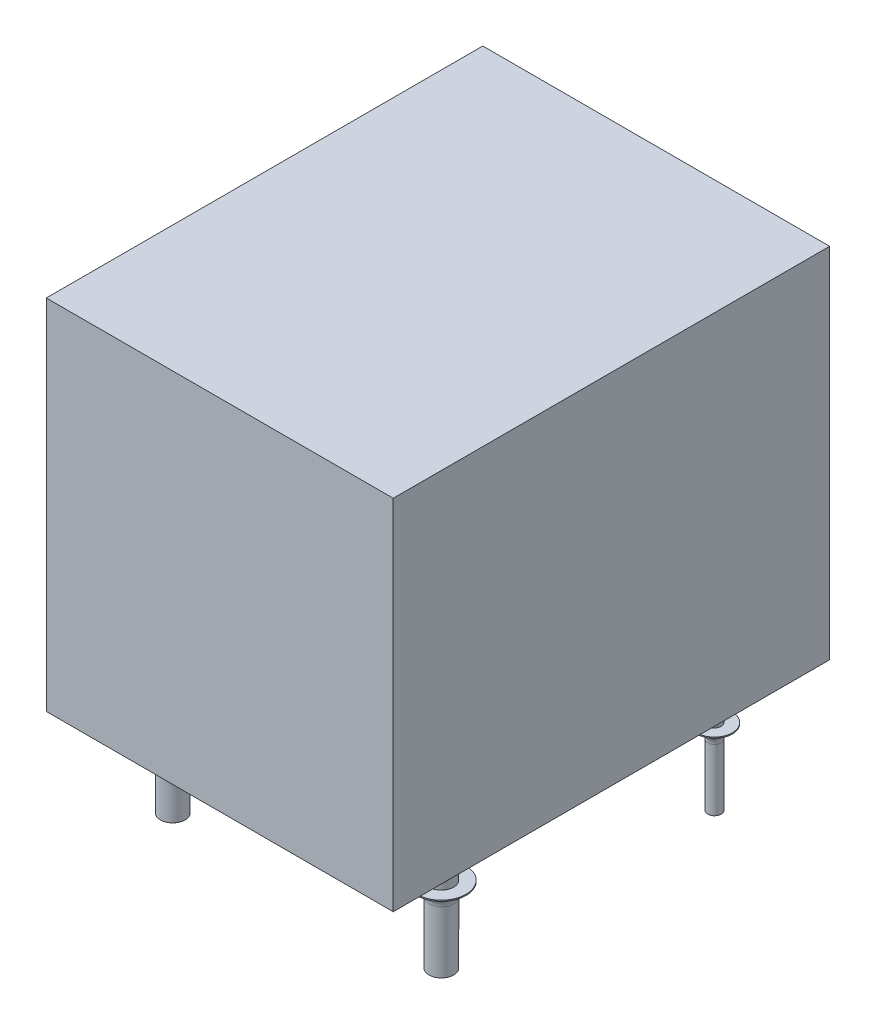
ISO-10303-21;
HEADER;
FILE_DESCRIPTION(('STEP AP214'),'2;1');
FILE_NAME('part.step','',(''),(''),'','','');
FILE_SCHEMA(('AUTOMOTIVE_DESIGN { 1 0 10303 214 1 1 1 1 }'));
ENDSEC;
DATA;
#1=APPLICATION_CONTEXT('core data for automotive mechanical design processes');
#2=APPLICATION_PROTOCOL_DEFINITION('international standard','automotive_design',2000,#1);
#3=PRODUCT_CONTEXT('',#1,'mechanical');
#4=PRODUCT('Part','Part','',(#3));
#5=PRODUCT_RELATED_PRODUCT_CATEGORY('part','',(#4));
#6=PRODUCT_DEFINITION_FORMATION('','',#4);
#7=PRODUCT_DEFINITION_CONTEXT('part definition',#1,'design');
#8=PRODUCT_DEFINITION('design','',#6,#7);
#9=PRODUCT_DEFINITION_SHAPE('','',#8);
#10=(LENGTH_UNIT() NAMED_UNIT(*) SI_UNIT(.MILLI.,.METRE.));
#11=(NAMED_UNIT(*) PLANE_ANGLE_UNIT() SI_UNIT($,.RADIAN.));
#12=(NAMED_UNIT(*) SI_UNIT($,.STERADIAN.) SOLID_ANGLE_UNIT());
#13=UNCERTAINTY_MEASURE_WITH_UNIT(LENGTH_MEASURE(1.E-05),#10,'distance_accuracy_value','');
#14=(GEOMETRIC_REPRESENTATION_CONTEXT(3) GLOBAL_UNCERTAINTY_ASSIGNED_CONTEXT((#13)) GLOBAL_UNIT_ASSIGNED_CONTEXT((#10,
#11,#12)) REPRESENTATION_CONTEXT('',''));
#15=CARTESIAN_POINT('',(0.,0.,0.));
#16=DIRECTION('',(0.,0.,1.));
#17=DIRECTION('',(1.,0.,0.));
#18=AXIS2_PLACEMENT_3D('',#15,#16,#17);
#19=CARTESIAN_POINT('',(13.75,-5.,-16.1));
#20=DIRECTION('',(0.,1.,0.));
#21=DIRECTION('',(0.,0.,1.));
#22=AXIS2_PLACEMENT_3D('',#19,#20,#21);
#23=CYLINDRICAL_SURFACE('',#22,0.300000000000001);
#24=CARTESIAN_POINT('',(13.75,0.,-16.1));
#25=DIRECTION('',(0.,-1.,0.));
#26=DIRECTION('',(0.,0.,-1.));
#27=AXIS2_PLACEMENT_3D('',#24,#25,#26);
#28=CIRCLE('',#27,0.300000000000001);
#29=CARTESIAN_POINT('',(13.75,0.,-16.4));
#30=VERTEX_POINT('',#29);
#31=EDGE_CURVE('E192',#30,#30,#28,.T.);
#32=ORIENTED_EDGE('',*,*,#31,.T.);
#33=EDGE_LOOP('',(#32));
#34=FACE_BOUND('',#33,.T.);
#35=CARTESIAN_POINT('',(13.75,-1.6,-16.1));
#36=DIRECTION('',(0.,-1.,0.));
#37=DIRECTION('',(0.,0.,-1.));
#38=AXIS2_PLACEMENT_3D('',#35,#36,#37);
#39=CIRCLE('',#38,0.300000000000001);
#40=CARTESIAN_POINT('',(13.75,-1.6,-16.4));
#41=VERTEX_POINT('',#40);
#42=EDGE_CURVE('E128',#41,#41,#39,.T.);
#43=ORIENTED_EDGE('',*,*,#42,.F.);
#44=EDGE_LOOP('',(#43));
#45=FACE_BOUND('',#44,.T.);
#46=ADVANCED_FACE('F38',(#34,#45),#23,.T.);
#47=CARTESIAN_POINT('',(1.75,-5.,-16.1));
#48=DIRECTION('',(0.,1.,0.));
#49=DIRECTION('',(0.,0.,1.));
#50=AXIS2_PLACEMENT_3D('',#47,#48,#49);
#51=CYLINDRICAL_SURFACE('',#50,0.300000000000001);
#52=CARTESIAN_POINT('',(1.75,0.,-16.1));
#53=DIRECTION('',(0.,-1.,0.));
#54=DIRECTION('',(0.,0.,-1.));
#55=AXIS2_PLACEMENT_3D('',#52,#53,#54);
#56=CIRCLE('',#55,0.300000000000001);
#57=CARTESIAN_POINT('',(1.75,0.,-16.4));
#58=VERTEX_POINT('',#57);
#59=EDGE_CURVE('E191',#58,#58,#56,.T.);
#60=ORIENTED_EDGE('',*,*,#59,.T.);
#61=EDGE_LOOP('',(#60));
#62=FACE_BOUND('',#61,.T.);
#63=CARTESIAN_POINT('',(1.75,-1.6,-16.1));
#64=DIRECTION('',(0.,-1.,0.));
#65=DIRECTION('',(0.,0.,-1.));
#66=AXIS2_PLACEMENT_3D('',#63,#64,#65);
#67=CIRCLE('',#66,0.300000000000001);
#68=CARTESIAN_POINT('',(1.75,-1.6,-16.4));
#69=VERTEX_POINT('',#68);
#70=EDGE_CURVE('E125',#69,#69,#67,.T.);
#71=ORIENTED_EDGE('',*,*,#70,.F.);
#72=EDGE_LOOP('',(#71));
#73=FACE_BOUND('',#72,.T.);
#74=ADVANCED_FACE('F159',(#62,#73),#51,.T.);
#75=CARTESIAN_POINT('',(7.75,-5.,-18.1));
#76=DIRECTION('',(0.,1.,0.));
#77=DIRECTION('',(0.,0.,1.));
#78=AXIS2_PLACEMENT_3D('',#75,#76,#77);
#79=CYLINDRICAL_SURFACE('',#78,0.549999999999996);
#80=CARTESIAN_POINT('',(7.75,0.,-18.1));
#81=DIRECTION('',(0.,-1.,0.));
#82=DIRECTION('',(0.,0.,-1.));
#83=AXIS2_PLACEMENT_3D('',#80,#81,#82);
#84=CIRCLE('',#83,0.549999999999996);
#85=CARTESIAN_POINT('',(7.75,0.,-18.65));
#86=VERTEX_POINT('',#85);
#87=EDGE_CURVE('E204',#86,#86,#84,.T.);
#88=ORIENTED_EDGE('',*,*,#87,.T.);
#89=EDGE_LOOP('',(#88));
#90=FACE_BOUND('',#89,.T.);
#91=CARTESIAN_POINT('',(7.75,-1.6,-18.1));
#92=DIRECTION('',(0.,-1.,0.));
#93=DIRECTION('',(0.,0.,-1.));
#94=AXIS2_PLACEMENT_3D('',#91,#92,#93);
#95=CIRCLE('',#94,0.549999999999996);
#96=CARTESIAN_POINT('',(7.75,-1.6,-18.65));
#97=VERTEX_POINT('',#96);
#98=EDGE_CURVE('E122',#97,#97,#95,.T.);
#99=ORIENTED_EDGE('',*,*,#98,.F.);
#100=EDGE_LOOP('',(#99));
#101=FACE_BOUND('',#100,.T.);
#102=ADVANCED_FACE('F166',(#90,#101),#79,.T.);
#103=CARTESIAN_POINT('',(13.75,-5.,-3.9));
#104=DIRECTION('',(0.,1.,0.));
#105=DIRECTION('',(0.,0.,1.));
#106=AXIS2_PLACEMENT_3D('',#103,#104,#105);
#107=CYLINDRICAL_SURFACE('',#106,0.55);
#108=CARTESIAN_POINT('',(13.75,0.,-3.9));
#109=DIRECTION('',(0.,-1.,0.));
#110=DIRECTION('',(0.,0.,-1.));
#111=AXIS2_PLACEMENT_3D('',#108,#109,#110);
#112=CIRCLE('',#111,0.55);
#113=CARTESIAN_POINT('',(13.75,0.,-4.45));
#114=VERTEX_POINT('',#113);
#115=EDGE_CURVE('E209',#114,#114,#112,.T.);
#116=ORIENTED_EDGE('',*,*,#115,.T.);
#117=EDGE_LOOP('',(#116));
#118=FACE_BOUND('',#117,.T.);
#119=CARTESIAN_POINT('',(13.75,-1.6,-3.9));
#120=DIRECTION('',(0.,-1.,0.));
#121=DIRECTION('',(0.,0.,-1.));
#122=AXIS2_PLACEMENT_3D('',#119,#120,#121);
#123=CIRCLE('',#122,0.55);
#124=CARTESIAN_POINT('',(13.75,-1.6,-4.45));
#125=VERTEX_POINT('',#124);
#126=EDGE_CURVE('E119',#125,#125,#123,.T.);
#127=ORIENTED_EDGE('',*,*,#126,.F.);
#128=EDGE_LOOP('',(#127));
#129=FACE_BOUND('',#128,.T.);
#130=ADVANCED_FACE('F238',(#118,#129),#107,.T.);
#131=CARTESIAN_POINT('',(1.75,-5.,-3.9));
#132=DIRECTION('',(0.,1.,0.));
#133=DIRECTION('',(0.,0.,1.));
#134=AXIS2_PLACEMENT_3D('',#131,#132,#133);
#135=CYLINDRICAL_SURFACE('',#134,0.55);
#136=CARTESIAN_POINT('',(1.75,0.,-3.9));
#137=DIRECTION('',(0.,-1.,0.));
#138=DIRECTION('',(0.,0.,-1.));
#139=AXIS2_PLACEMENT_3D('',#136,#137,#138);
#140=CIRCLE('',#139,0.55);
#141=CARTESIAN_POINT('',(1.75,0.,-4.45));
#142=VERTEX_POINT('',#141);
#143=EDGE_CURVE('E215',#142,#142,#140,.T.);
#144=ORIENTED_EDGE('',*,*,#143,.T.);
#145=EDGE_LOOP('',(#144));
#146=FACE_BOUND('',#145,.T.);
#147=CARTESIAN_POINT('',(1.75,-1.6,-3.9));
#148=DIRECTION('',(0.,-1.,0.));
#149=DIRECTION('',(0.,0.,-1.));
#150=AXIS2_PLACEMENT_3D('',#147,#148,#149);
#151=CIRCLE('',#150,0.55);
#152=CARTESIAN_POINT('',(1.75,-1.6,-4.45));
#153=VERTEX_POINT('',#152);
#154=EDGE_CURVE('E116',#153,#153,#151,.T.);
#155=ORIENTED_EDGE('',*,*,#154,.F.);
#156=EDGE_LOOP('',(#155));
#157=FACE_BOUND('',#156,.T.);
#158=ADVANCED_FACE('F223',(#146,#157),#135,.T.);
#159=CARTESIAN_POINT('',(0.,0.,0.));
#160=DIRECTION('',(0.,-1.,0.));
#161=DIRECTION('',(0.,0.,-1.));
#162=AXIS2_PLACEMENT_3D('',#159,#160,#161);
#163=PLANE('',#162);
#164=ORIENTED_EDGE('',*,*,#59,.F.);
#165=EDGE_LOOP('',(#164));
#166=FACE_BOUND('',#165,.T.);
#167=ORIENTED_EDGE('',*,*,#115,.F.);
#168=EDGE_LOOP('',(#167));
#169=FACE_BOUND('',#168,.T.);
#170=DIRECTION('',(0.,0.,1.));
#171=VECTOR('',#170,1.);
#172=CARTESIAN_POINT('',(0.,0.,0.));
#173=LINE('',#172,#171);
#174=CARTESIAN_POINT('',(0.,0.,-19.5));
#175=VERTEX_POINT('',#174);
#176=CARTESIAN_POINT('',(0.,0.,0.));
#177=VERTEX_POINT('',#176);
#178=EDGE_CURVE('E106',#175,#177,#173,.T.);
#179=ORIENTED_EDGE('',*,*,#178,.F.);
#180=DIRECTION('',(-1.,0.,0.));
#181=VECTOR('',#180,1.);
#182=CARTESIAN_POINT('',(0.,0.,-19.5));
#183=LINE('',#182,#181);
#184=CARTESIAN_POINT('',(15.5,0.,-19.5));
#185=VERTEX_POINT('',#184);
#186=EDGE_CURVE('E78',#185,#175,#183,.T.);
#187=ORIENTED_EDGE('',*,*,#186,.F.);
#188=DIRECTION('',(0.,0.,-1.));
#189=VECTOR('',#188,1.);
#190=CARTESIAN_POINT('',(15.5,0.,0.));
#191=LINE('',#190,#189);
#192=CARTESIAN_POINT('',(15.5,0.,0.));
#193=VERTEX_POINT('',#192);
#194=EDGE_CURVE('E72',#193,#185,#191,.T.);
#195=ORIENTED_EDGE('',*,*,#194,.F.);
#196=DIRECTION('',(1.,0.,0.));
#197=VECTOR('',#196,1.);
#198=CARTESIAN_POINT('',(0.,0.,0.));
#199=LINE('',#198,#197);
#200=EDGE_CURVE('E96',#177,#193,#199,.T.);
#201=ORIENTED_EDGE('',*,*,#200,.F.);
#202=EDGE_LOOP('',(#179,#187,#195,#201));
#203=FACE_BOUND('',#202,.T.);
#204=ORIENTED_EDGE('',*,*,#143,.F.);
#205=EDGE_LOOP('',(#204));
#206=FACE_BOUND('',#205,.T.);
#207=ORIENTED_EDGE('',*,*,#87,.F.);
#208=EDGE_LOOP('',(#207));
#209=FACE_BOUND('',#208,.T.);
#210=ORIENTED_EDGE('',*,*,#31,.F.);
#211=EDGE_LOOP('',(#210));
#212=FACE_BOUND('',#211,.T.);
#213=ADVANCED_FACE('F226',(#166,#169,#203,#206,#209,#212),#163,.T.);
#214=CARTESIAN_POINT('',(0.,16.,0.));
#215=DIRECTION('',(1.,0.,0.));
#216=DIRECTION('',(0.,0.,-1.));
#217=AXIS2_PLACEMENT_3D('',#214,#215,#216);
#218=PLANE('',#217);
#219=ORIENTED_EDGE('',*,*,#178,.T.);
#220=DIRECTION('',(0.,-1.,0.));
#221=VECTOR('',#220,1.);
#222=CARTESIAN_POINT('',(0.,16.,0.));
#223=LINE('',#222,#221);
#224=CARTESIAN_POINT('',(0.,16.,0.));
#225=VERTEX_POINT('',#224);
#226=EDGE_CURVE('E97',#225,#177,#223,.T.);
#227=ORIENTED_EDGE('',*,*,#226,.F.);
#228=DIRECTION('',(0.,0.,1.));
#229=VECTOR('',#228,1.);
#230=CARTESIAN_POINT('',(0.,16.,0.));
#231=LINE('',#230,#229);
#232=CARTESIAN_POINT('',(0.,16.,-19.5));
#233=VERTEX_POINT('',#232);
#234=EDGE_CURVE('E91',#233,#225,#231,.T.);
#235=ORIENTED_EDGE('',*,*,#234,.F.);
#236=DIRECTION('',(0.,-1.,0.));
#237=VECTOR('',#236,1.);
#238=CARTESIAN_POINT('',(0.,16.,-19.5));
#239=LINE('',#238,#237);
#240=EDGE_CURVE('E102',#233,#175,#239,.T.);
#241=ORIENTED_EDGE('',*,*,#240,.T.);
#242=EDGE_LOOP('',(#219,#227,#235,#241));
#243=FACE_BOUND('',#242,.T.);
#244=ADVANCED_FACE('F229',(#243),#218,.F.);
#245=CARTESIAN_POINT('',(0.,16.,0.));
#246=DIRECTION('',(0.,0.,-1.));
#247=DIRECTION('',(-1.,0.,0.));
#248=AXIS2_PLACEMENT_3D('',#245,#246,#247);
#249=PLANE('',#248);
#250=ORIENTED_EDGE('',*,*,#200,.T.);
#251=DIRECTION('',(0.,-1.,0.));
#252=VECTOR('',#251,1.);
#253=CARTESIAN_POINT('',(15.5,16.,0.));
#254=LINE('',#253,#252);
#255=CARTESIAN_POINT('',(15.5,16.,0.));
#256=VERTEX_POINT('',#255);
#257=EDGE_CURVE('E94',#256,#193,#254,.T.);
#258=ORIENTED_EDGE('',*,*,#257,.F.);
#259=DIRECTION('',(1.,0.,0.));
#260=VECTOR('',#259,1.);
#261=CARTESIAN_POINT('',(0.,16.,0.));
#262=LINE('',#261,#260);
#263=EDGE_CURVE('E86',#225,#256,#262,.T.);
#264=ORIENTED_EDGE('',*,*,#263,.F.);
#265=ORIENTED_EDGE('',*,*,#226,.T.);
#266=EDGE_LOOP('',(#250,#258,#264,#265));
#267=FACE_BOUND('',#266,.T.);
#268=ADVANCED_FACE('F95',(#267),#249,.F.);
#269=CARTESIAN_POINT('',(15.5,16.,0.));
#270=DIRECTION('',(-1.,0.,0.));
#271=DIRECTION('',(0.,0.,1.));
#272=AXIS2_PLACEMENT_3D('',#269,#270,#271);
#273=PLANE('',#272);
#274=ORIENTED_EDGE('',*,*,#194,.T.);
#275=DIRECTION('',(0.,-1.,0.));
#276=VECTOR('',#275,1.);
#277=CARTESIAN_POINT('',(15.5,16.,-19.5));
#278=LINE('',#277,#276);
#279=CARTESIAN_POINT('',(15.5,16.,-19.5));
#280=VERTEX_POINT('',#279);
#281=EDGE_CURVE('E98',#280,#185,#278,.T.);
#282=ORIENTED_EDGE('',*,*,#281,.F.);
#283=DIRECTION('',(0.,0.,-1.));
#284=VECTOR('',#283,1.);
#285=CARTESIAN_POINT('',(15.5,16.,0.));
#286=LINE('',#285,#284);
#287=EDGE_CURVE('E89',#256,#280,#286,.T.);
#288=ORIENTED_EDGE('',*,*,#287,.F.);
#289=ORIENTED_EDGE('',*,*,#257,.T.);
#290=EDGE_LOOP('',(#274,#282,#288,#289));
#291=FACE_BOUND('',#290,.T.);
#292=ADVANCED_FACE('F100',(#291),#273,.F.);
#293=CARTESIAN_POINT('',(0.,16.,-19.5));
#294=DIRECTION('',(0.,0.,1.));
#295=DIRECTION('',(1.,0.,0.));
#296=AXIS2_PLACEMENT_3D('',#293,#294,#295);
#297=PLANE('',#296);
#298=ORIENTED_EDGE('',*,*,#186,.T.);
#299=ORIENTED_EDGE('',*,*,#240,.F.);
#300=DIRECTION('',(-1.,0.,0.));
#301=VECTOR('',#300,1.);
#302=CARTESIAN_POINT('',(0.,16.,-19.5));
#303=LINE('',#302,#301);
#304=EDGE_CURVE('E55',#280,#233,#303,.T.);
#305=ORIENTED_EDGE('',*,*,#304,.F.);
#306=ORIENTED_EDGE('',*,*,#281,.T.);
#307=EDGE_LOOP('',(#298,#299,#305,#306));
#308=FACE_BOUND('',#307,.T.);
#309=ADVANCED_FACE('F360',(#308),#297,.F.);
#310=CARTESIAN_POINT('',(0.,16.,0.));
#311=DIRECTION('',(0.,-1.,0.));
#312=DIRECTION('',(0.,0.,-1.));
#313=AXIS2_PLACEMENT_3D('',#310,#311,#312);
#314=PLANE('',#313);
#315=ORIENTED_EDGE('',*,*,#234,.T.);
#316=ORIENTED_EDGE('',*,*,#263,.T.);
#317=ORIENTED_EDGE('',*,*,#287,.T.);
#318=ORIENTED_EDGE('',*,*,#304,.T.);
#319=EDGE_LOOP('',(#315,#316,#317,#318));
#320=FACE_BOUND('',#319,.T.);
#321=ADVANCED_FACE('F87',(#320),#314,.F.);
#322=CARTESIAN_POINT('',(1.75,-1.6,-3.9));
#323=DIRECTION('',(0.,-1.,0.));
#324=DIRECTION('',(0.,0.,-1.));
#325=AXIS2_PLACEMENT_3D('',#322,#323,#324);
#326=PLANE('',#325);
#327=CARTESIAN_POINT('',(1.75,-1.6,-3.9));
#328=DIRECTION('',(0.,-1.,0.));
#329=DIRECTION('',(0.,0.,-1.));
#330=AXIS2_PLACEMENT_3D('',#327,#328,#329);
#331=CIRCLE('',#330,1.1);
#332=CARTESIAN_POINT('',(1.75,-1.6,-5.));
#333=VERTEX_POINT('',#332);
#334=EDGE_CURVE('E200',#333,#333,#331,.T.);
#335=ORIENTED_EDGE('',*,*,#334,.F.);
#336=EDGE_LOOP('',(#335));
#337=FACE_BOUND('',#336,.T.);
#338=ORIENTED_EDGE('',*,*,#154,.T.);
#339=EDGE_LOOP('',(#338));
#340=FACE_BOUND('',#339,.T.);
#341=ADVANCED_FACE('F271',(#337,#340),#326,.F.);
#342=CARTESIAN_POINT('',(1.75,-1.65,-3.9));
#343=DIRECTION('',(0.,1.,0.));
#344=DIRECTION('',(0.,0.,1.));
#345=AXIS2_PLACEMENT_3D('',#342,#343,#344);
#346=CYLINDRICAL_SURFACE('',#345,1.1);
#347=CARTESIAN_POINT('',(1.75,-1.65,-3.9));
#348=DIRECTION('',(0.,-1.,0.));
#349=DIRECTION('',(0.,0.,-1.));
#350=AXIS2_PLACEMENT_3D('',#347,#348,#349);
#351=CIRCLE('',#350,1.1);
#352=CARTESIAN_POINT('',(1.75,-1.65,-5.));
#353=VERTEX_POINT('',#352);
#354=EDGE_CURVE('E197',#353,#353,#351,.T.);
#355=ORIENTED_EDGE('',*,*,#354,.F.);
#356=EDGE_LOOP('',(#355));
#357=FACE_BOUND('',#356,.T.);
#358=ORIENTED_EDGE('',*,*,#334,.T.);
#359=EDGE_LOOP('',(#358));
#360=FACE_BOUND('',#359,.T.);
#361=ADVANCED_FACE('F274',(#357,#360),#346,.T.);
#362=CARTESIAN_POINT('',(1.75,-5.,-3.9));
#363=DIRECTION('',(0.,-1.,0.));
#364=DIRECTION('',(0.,0.,-1.));
#365=AXIS2_PLACEMENT_3D('',#362,#363,#364);
#366=PLANE('',#365);
#367=CARTESIAN_POINT('',(1.75,-5.,-3.9));
#368=DIRECTION('',(0.,-1.,0.));
#369=DIRECTION('',(0.,0.,-1.));
#370=AXIS2_PLACEMENT_3D('',#367,#368,#369);
#371=CIRCLE('',#370,0.55);
#372=CARTESIAN_POINT('',(1.75,-5.,-4.45));
#373=VERTEX_POINT('',#372);
#374=EDGE_CURVE('E109',#373,#373,#371,.T.);
#375=ORIENTED_EDGE('',*,*,#374,.T.);
#376=EDGE_LOOP('',(#375));
#377=FACE_BOUND('',#376,.T.);
#378=ADVANCED_FACE('F277',(#377),#366,.T.);
#379=CARTESIAN_POINT('',(1.75,-2.24791303715507,-3.9));
#380=DIRECTION('',(0.,1.,0.));
#381=DIRECTION('',(0.,0.,1.));
#382=AXIS2_PLACEMENT_3D('',#379,#380,#381);
#383=CIRCLE('',#382,0.55);
#384=CARTESIAN_POINT('',(1.75,-2.24791303715507,-3.35));
#385=VERTEX_POINT('',#384);
#386=EDGE_CURVE('E11',#385,#385,#383,.F.);
#387=ORIENTED_EDGE('',*,*,#386,.T.);
#388=EDGE_LOOP('',(#387));
#389=FACE_BOUND('',#388,.T.);
#390=ORIENTED_EDGE('',*,*,#374,.F.);
#391=EDGE_LOOP('',(#390));
#392=FACE_BOUND('',#391,.T.);
#393=ADVANCED_FACE('F266',(#389,#392),#135,.T.);
#394=CARTESIAN_POINT('',(13.75,-1.6,-3.9));
#395=DIRECTION('',(0.,-1.,0.));
#396=DIRECTION('',(0.,0.,-1.));
#397=AXIS2_PLACEMENT_3D('',#394,#395,#396);
#398=PLANE('',#397);
#399=CARTESIAN_POINT('',(13.75,-1.6,-3.9));
#400=DIRECTION('',(0.,-1.,0.));
#401=DIRECTION('',(0.,0.,-1.));
#402=AXIS2_PLACEMENT_3D('',#399,#400,#401);
#403=CIRCLE('',#402,1.1);
#404=CARTESIAN_POINT('',(13.75,-1.6,-5.));
#405=VERTEX_POINT('',#404);
#406=EDGE_CURVE('E290',#405,#405,#403,.T.);
#407=ORIENTED_EDGE('',*,*,#406,.F.);
#408=EDGE_LOOP('',(#407));
#409=FACE_BOUND('',#408,.T.);
#410=ORIENTED_EDGE('',*,*,#126,.T.);
#411=EDGE_LOOP('',(#410));
#412=FACE_BOUND('',#411,.T.);
#413=ADVANCED_FACE('F262',(#409,#412),#398,.F.);
#414=CARTESIAN_POINT('',(13.75,-1.65,-3.9));
#415=DIRECTION('',(0.,1.,0.));
#416=DIRECTION('',(0.,0.,1.));
#417=AXIS2_PLACEMENT_3D('',#414,#415,#416);
#418=CYLINDRICAL_SURFACE('',#417,1.1);
#419=CARTESIAN_POINT('',(13.75,-1.65,-3.9));
#420=DIRECTION('',(0.,-1.,0.));
#421=DIRECTION('',(0.,0.,-1.));
#422=AXIS2_PLACEMENT_3D('',#419,#420,#421);
#423=CIRCLE('',#422,1.1);
#424=CARTESIAN_POINT('',(13.75,-1.65,-5.));
#425=VERTEX_POINT('',#424);
#426=EDGE_CURVE('E289',#425,#425,#423,.T.);
#427=ORIENTED_EDGE('',*,*,#426,.F.);
#428=EDGE_LOOP('',(#427));
#429=FACE_BOUND('',#428,.T.);
#430=ORIENTED_EDGE('',*,*,#406,.T.);
#431=EDGE_LOOP('',(#430));
#432=FACE_BOUND('',#431,.T.);
#433=ADVANCED_FACE('F265',(#429,#432),#418,.T.);
#434=CARTESIAN_POINT('',(13.75,-5.,-3.9));
#435=DIRECTION('',(0.,-1.,0.));
#436=DIRECTION('',(0.,0.,-1.));
#437=AXIS2_PLACEMENT_3D('',#434,#435,#436);
#438=PLANE('',#437);
#439=CARTESIAN_POINT('',(13.75,-5.,-3.9));
#440=DIRECTION('',(0.,-1.,0.));
#441=DIRECTION('',(0.,0.,-1.));
#442=AXIS2_PLACEMENT_3D('',#439,#440,#441);
#443=CIRCLE('',#442,0.55);
#444=CARTESIAN_POINT('',(13.75,-5.,-4.45));
#445=VERTEX_POINT('',#444);
#446=EDGE_CURVE('E212',#445,#445,#443,.T.);
#447=ORIENTED_EDGE('',*,*,#446,.T.);
#448=EDGE_LOOP('',(#447));
#449=FACE_BOUND('',#448,.T.);
#450=ADVANCED_FACE('F255',(#449),#438,.T.);
#451=CARTESIAN_POINT('',(13.75,-2.24791303715507,-3.9));
#452=DIRECTION('',(0.,1.,0.));
#453=DIRECTION('',(0.,0.,1.));
#454=AXIS2_PLACEMENT_3D('',#451,#452,#453);
#455=CIRCLE('',#454,0.55);
#456=CARTESIAN_POINT('',(13.75,-2.24791303715507,-3.35));
#457=VERTEX_POINT('',#456);
#458=EDGE_CURVE('E47',#457,#457,#455,.F.);
#459=ORIENTED_EDGE('',*,*,#458,.T.);
#460=EDGE_LOOP('',(#459));
#461=FACE_BOUND('',#460,.T.);
#462=ORIENTED_EDGE('',*,*,#446,.F.);
#463=EDGE_LOOP('',(#462));
#464=FACE_BOUND('',#463,.T.);
#465=ADVANCED_FACE('F142',(#461,#464),#107,.T.);
#466=CARTESIAN_POINT('',(7.75,-1.6,-18.1));
#467=DIRECTION('',(0.,-1.,0.));
#468=DIRECTION('',(0.,0.,-1.));
#469=AXIS2_PLACEMENT_3D('',#466,#467,#468);
#470=PLANE('',#469);
#471=CARTESIAN_POINT('',(7.75,-1.6,-18.1));
#472=DIRECTION('',(0.,-1.,0.));
#473=DIRECTION('',(0.,0.,-1.));
#474=AXIS2_PLACEMENT_3D('',#471,#472,#473);
#475=CIRCLE('',#474,1.1);
#476=CARTESIAN_POINT('',(7.75,-1.6,-19.2));
#477=VERTEX_POINT('',#476);
#478=EDGE_CURVE('E297',#477,#477,#475,.T.);
#479=ORIENTED_EDGE('',*,*,#478,.F.);
#480=EDGE_LOOP('',(#479));
#481=FACE_BOUND('',#480,.T.);
#482=ORIENTED_EDGE('',*,*,#98,.T.);
#483=EDGE_LOOP('',(#482));
#484=FACE_BOUND('',#483,.T.);
#485=ADVANCED_FACE('F243',(#481,#484),#470,.F.);
#486=CARTESIAN_POINT('',(7.75,-1.65,-18.1));
#487=DIRECTION('',(0.,1.,0.));
#488=DIRECTION('',(0.,0.,1.));
#489=AXIS2_PLACEMENT_3D('',#486,#487,#488);
#490=CYLINDRICAL_SURFACE('',#489,1.1);
#491=CARTESIAN_POINT('',(7.75,-1.65,-18.1));
#492=DIRECTION('',(0.,-1.,0.));
#493=DIRECTION('',(0.,0.,-1.));
#494=AXIS2_PLACEMENT_3D('',#491,#492,#493);
#495=CIRCLE('',#494,1.1);
#496=CARTESIAN_POINT('',(7.75,-1.65,-19.2));
#497=VERTEX_POINT('',#496);
#498=EDGE_CURVE('E294',#497,#497,#495,.T.);
#499=ORIENTED_EDGE('',*,*,#498,.F.);
#500=EDGE_LOOP('',(#499));
#501=FACE_BOUND('',#500,.T.);
#502=ORIENTED_EDGE('',*,*,#478,.T.);
#503=EDGE_LOOP('',(#502));
#504=FACE_BOUND('',#503,.T.);
#505=ADVANCED_FACE('F245',(#501,#504),#490,.T.);
#506=CARTESIAN_POINT('',(7.75,-5.,-18.1));
#507=DIRECTION('',(0.,-1.,0.));
#508=DIRECTION('',(0.,0.,-1.));
#509=AXIS2_PLACEMENT_3D('',#506,#507,#508);
#510=PLANE('',#509);
#511=CARTESIAN_POINT('',(7.75,-5.,-18.1));
#512=DIRECTION('',(0.,-1.,0.));
#513=DIRECTION('',(0.,0.,-1.));
#514=AXIS2_PLACEMENT_3D('',#511,#512,#513);
#515=CIRCLE('',#514,0.549999999999996);
#516=CARTESIAN_POINT('',(7.75,-5.,-18.65));
#517=VERTEX_POINT('',#516);
#518=EDGE_CURVE('E206',#517,#517,#515,.T.);
#519=ORIENTED_EDGE('',*,*,#518,.T.);
#520=EDGE_LOOP('',(#519));
#521=FACE_BOUND('',#520,.T.);
#522=ADVANCED_FACE('F252',(#521),#510,.T.);
#523=CARTESIAN_POINT('',(7.75,-2.24791303715507,-18.1));
#524=DIRECTION('',(0.,1.,0.));
#525=DIRECTION('',(0.,0.,1.));
#526=AXIS2_PLACEMENT_3D('',#523,#524,#525);
#527=CIRCLE('',#526,0.549999999999996);
#528=CARTESIAN_POINT('',(7.75,-2.24791303715507,-17.55));
#529=VERTEX_POINT('',#528);
#530=EDGE_CURVE('E137',#529,#529,#527,.F.);
#531=ORIENTED_EDGE('',*,*,#530,.T.);
#532=EDGE_LOOP('',(#531));
#533=FACE_BOUND('',#532,.T.);
#534=ORIENTED_EDGE('',*,*,#518,.F.);
#535=EDGE_LOOP('',(#534));
#536=FACE_BOUND('',#535,.T.);
#537=ADVANCED_FACE('F240',(#533,#536),#79,.T.);
#538=CARTESIAN_POINT('',(1.75,-1.6,-16.1));
#539=DIRECTION('',(0.,-1.,0.));
#540=DIRECTION('',(0.,0.,-1.));
#541=AXIS2_PLACEMENT_3D('',#538,#539,#540);
#542=PLANE('',#541);
#543=CARTESIAN_POINT('',(1.75,-1.6,-16.1));
#544=DIRECTION('',(0.,-1.,0.));
#545=DIRECTION('',(0.,0.,-1.));
#546=AXIS2_PLACEMENT_3D('',#543,#544,#545);
#547=CIRCLE('',#546,0.799999999999999);
#548=CARTESIAN_POINT('',(1.75,-1.6,-16.9));
#549=VERTEX_POINT('',#548);
#550=EDGE_CURVE('E303',#549,#549,#547,.T.);
#551=ORIENTED_EDGE('',*,*,#550,.F.);
#552=EDGE_LOOP('',(#551));
#553=FACE_BOUND('',#552,.T.);
#554=ORIENTED_EDGE('',*,*,#70,.T.);
#555=EDGE_LOOP('',(#554));
#556=FACE_BOUND('',#555,.T.);
#557=ADVANCED_FACE('F332',(#553,#556),#542,.F.);
#558=CARTESIAN_POINT('',(1.75,-1.65,-16.1));
#559=DIRECTION('',(0.,1.,0.));
#560=DIRECTION('',(0.,0.,1.));
#561=AXIS2_PLACEMENT_3D('',#558,#559,#560);
#562=CYLINDRICAL_SURFACE('',#561,0.799999999999999);
#563=CARTESIAN_POINT('',(1.75,-1.65,-16.1));
#564=DIRECTION('',(0.,-1.,0.));
#565=DIRECTION('',(0.,0.,-1.));
#566=AXIS2_PLACEMENT_3D('',#563,#564,#565);
#567=CIRCLE('',#566,0.799999999999999);
#568=CARTESIAN_POINT('',(1.75,-1.65,-16.9));
#569=VERTEX_POINT('',#568);
#570=EDGE_CURVE('E300',#569,#569,#567,.T.);
#571=ORIENTED_EDGE('',*,*,#570,.F.);
#572=EDGE_LOOP('',(#571));
#573=FACE_BOUND('',#572,.T.);
#574=ORIENTED_EDGE('',*,*,#550,.T.);
#575=EDGE_LOOP('',(#574));
#576=FACE_BOUND('',#575,.T.);
#577=ADVANCED_FACE('F259',(#573,#576),#562,.T.);
#578=CARTESIAN_POINT('',(1.75,-5.,-16.1));
#579=DIRECTION('',(0.,-1.,0.));
#580=DIRECTION('',(0.,0.,-1.));
#581=AXIS2_PLACEMENT_3D('',#578,#579,#580);
#582=PLANE('',#581);
#583=CARTESIAN_POINT('',(1.75,-5.,-16.1));
#584=DIRECTION('',(0.,-1.,0.));
#585=DIRECTION('',(0.,0.,-1.));
#586=AXIS2_PLACEMENT_3D('',#583,#584,#585);
#587=CIRCLE('',#586,0.300000000000001);
#588=CARTESIAN_POINT('',(1.75,-5.,-16.4));
#589=VERTEX_POINT('',#588);
#590=EDGE_CURVE('E195',#589,#589,#587,.T.);
#591=ORIENTED_EDGE('',*,*,#590,.T.);
#592=EDGE_LOOP('',(#591));
#593=FACE_BOUND('',#592,.T.);
#594=ADVANCED_FACE('F330',(#593),#582,.T.);
#595=CARTESIAN_POINT('',(1.75,-2.24160797830996,-16.1));
#596=DIRECTION('',(0.,1.,0.));
#597=DIRECTION('',(0.,0.,1.));
#598=AXIS2_PLACEMENT_3D('',#595,#596,#597);
#599=CIRCLE('',#598,0.300000000000001);
#600=CARTESIAN_POINT('',(1.75,-2.24160797830996,-15.8));
#601=VERTEX_POINT('',#600);
#602=EDGE_CURVE('E131',#601,#601,#599,.F.);
#603=ORIENTED_EDGE('',*,*,#602,.T.);
#604=EDGE_LOOP('',(#603));
#605=FACE_BOUND('',#604,.T.);
#606=ORIENTED_EDGE('',*,*,#590,.F.);
#607=EDGE_LOOP('',(#606));
#608=FACE_BOUND('',#607,.T.);
#609=ADVANCED_FACE('F169',(#605,#608),#51,.T.);
#610=CARTESIAN_POINT('',(13.75,-1.6,-16.1));
#611=DIRECTION('',(0.,-1.,0.));
#612=DIRECTION('',(0.,0.,-1.));
#613=AXIS2_PLACEMENT_3D('',#610,#611,#612);
#614=PLANE('',#613);
#615=CARTESIAN_POINT('',(13.75,-1.6,-16.1));
#616=DIRECTION('',(0.,-1.,0.));
#617=DIRECTION('',(0.,0.,-1.));
#618=AXIS2_PLACEMENT_3D('',#615,#616,#617);
#619=CIRCLE('',#618,0.8);
#620=CARTESIAN_POINT('',(13.75,-1.6,-16.9));
#621=VERTEX_POINT('',#620);
#622=EDGE_CURVE('E309',#621,#621,#619,.T.);
#623=ORIENTED_EDGE('',*,*,#622,.F.);
#624=EDGE_LOOP('',(#623));
#625=FACE_BOUND('',#624,.T.);
#626=ORIENTED_EDGE('',*,*,#42,.T.);
#627=EDGE_LOOP('',(#626));
#628=FACE_BOUND('',#627,.T.);
#629=ADVANCED_FACE('F319',(#625,#628),#614,.F.);
#630=CARTESIAN_POINT('',(13.75,-1.65,-16.1));
#631=DIRECTION('',(0.,1.,0.));
#632=DIRECTION('',(0.,0.,1.));
#633=AXIS2_PLACEMENT_3D('',#630,#631,#632);
#634=CYLINDRICAL_SURFACE('',#633,0.8);
#635=CARTESIAN_POINT('',(13.75,-1.65,-16.1));
#636=DIRECTION('',(0.,-1.,0.));
#637=DIRECTION('',(0.,0.,-1.));
#638=AXIS2_PLACEMENT_3D('',#635,#636,#637);
#639=CIRCLE('',#638,0.8);
#640=CARTESIAN_POINT('',(13.75,-1.65,-16.9));
#641=VERTEX_POINT('',#640);
#642=EDGE_CURVE('E306',#641,#641,#639,.T.);
#643=ORIENTED_EDGE('',*,*,#642,.F.);
#644=EDGE_LOOP('',(#643));
#645=FACE_BOUND('',#644,.T.);
#646=ORIENTED_EDGE('',*,*,#622,.T.);
#647=EDGE_LOOP('',(#646));
#648=FACE_BOUND('',#647,.T.);
#649=ADVANCED_FACE('F184',(#645,#648),#634,.T.);
#650=CARTESIAN_POINT('',(13.75,-5.,-16.1));
#651=DIRECTION('',(0.,-1.,0.));
#652=DIRECTION('',(0.,0.,-1.));
#653=AXIS2_PLACEMENT_3D('',#650,#651,#652);
#654=PLANE('',#653);
#655=CARTESIAN_POINT('',(13.75,-5.,-16.1));
#656=DIRECTION('',(0.,-1.,0.));
#657=DIRECTION('',(0.,0.,-1.));
#658=AXIS2_PLACEMENT_3D('',#655,#656,#657);
#659=CIRCLE('',#658,0.300000000000001);
#660=CARTESIAN_POINT('',(13.75,-5.,-16.4));
#661=VERTEX_POINT('',#660);
#662=EDGE_CURVE('E190',#661,#661,#659,.T.);
#663=ORIENTED_EDGE('',*,*,#662,.T.);
#664=EDGE_LOOP('',(#663));
#665=FACE_BOUND('',#664,.T.);
#666=ADVANCED_FACE('F176',(#665),#654,.T.);
#667=CARTESIAN_POINT('',(13.75,-2.24160797830996,-16.1));
#668=DIRECTION('',(0.,1.,0.));
#669=DIRECTION('',(0.,0.,1.));
#670=AXIS2_PLACEMENT_3D('',#667,#668,#669);
#671=CIRCLE('',#670,0.300000000000001);
#672=CARTESIAN_POINT('',(13.75,-2.24160797830996,-15.8));
#673=VERTEX_POINT('',#672);
#674=EDGE_CURVE('E134',#673,#673,#671,.F.);
#675=ORIENTED_EDGE('',*,*,#674,.T.);
#676=EDGE_LOOP('',(#675));
#677=FACE_BOUND('',#676,.T.);
#678=ORIENTED_EDGE('',*,*,#662,.F.);
#679=EDGE_LOOP('',(#678));
#680=FACE_BOUND('',#679,.T.);
#681=ADVANCED_FACE('F162',(#677,#680),#23,.T.);
#682=CARTESIAN_POINT('',(1.75,-2.24160797830996,-16.1));
#683=DIRECTION('',(0.,1.,0.));
#684=DIRECTION('',(0.,0.,1.));
#685=AXIS2_PLACEMENT_3D('',#682,#683,#684);
#686=TOROIDAL_SURFACE('',#685,0.900000000000001,0.6);
#687=ORIENTED_EDGE('',*,*,#570,.T.);
#688=EDGE_LOOP('',(#687));
#689=FACE_BOUND('',#688,.T.);
#690=ORIENTED_EDGE('',*,*,#602,.F.);
#691=EDGE_LOOP('',(#690));
#692=FACE_BOUND('',#691,.T.);
#693=ADVANCED_FACE('F175',(#689,#692),#686,.F.);
#694=CARTESIAN_POINT('',(13.75,-2.24160797830996,-16.1));
#695=DIRECTION('',(0.,1.,0.));
#696=DIRECTION('',(0.,0.,1.));
#697=AXIS2_PLACEMENT_3D('',#694,#695,#696);
#698=TOROIDAL_SURFACE('',#697,0.9,0.6);
#699=ORIENTED_EDGE('',*,*,#642,.T.);
#700=EDGE_LOOP('',(#699));
#701=FACE_BOUND('',#700,.T.);
#702=ORIENTED_EDGE('',*,*,#674,.F.);
#703=EDGE_LOOP('',(#702));
#704=FACE_BOUND('',#703,.T.);
#705=ADVANCED_FACE('F154',(#701,#704),#698,.F.);
#706=CARTESIAN_POINT('',(7.75,-2.24791303715507,-18.1));
#707=DIRECTION('',(0.,1.,0.));
#708=DIRECTION('',(0.,0.,1.));
#709=AXIS2_PLACEMENT_3D('',#706,#707,#708);
#710=TOROIDAL_SURFACE('',#709,1.15,0.6);
#711=ORIENTED_EDGE('',*,*,#498,.T.);
#712=EDGE_LOOP('',(#711));
#713=FACE_BOUND('',#712,.T.);
#714=ORIENTED_EDGE('',*,*,#530,.F.);
#715=EDGE_LOOP('',(#714));
#716=FACE_BOUND('',#715,.T.);
#717=ADVANCED_FACE('F147',(#713,#716),#710,.F.);
#718=CARTESIAN_POINT('',(13.75,-2.24791303715507,-3.9));
#719=DIRECTION('',(0.,1.,0.));
#720=DIRECTION('',(0.,0.,1.));
#721=AXIS2_PLACEMENT_3D('',#718,#719,#720);
#722=TOROIDAL_SURFACE('',#721,1.15,0.6);
#723=ORIENTED_EDGE('',*,*,#426,.T.);
#724=EDGE_LOOP('',(#723));
#725=FACE_BOUND('',#724,.T.);
#726=ORIENTED_EDGE('',*,*,#458,.F.);
#727=EDGE_LOOP('',(#726));
#728=FACE_BOUND('',#727,.T.);
#729=ADVANCED_FACE('F145',(#725,#728),#722,.F.);
#730=CARTESIAN_POINT('',(1.75,-2.24791303715507,-3.9));
#731=DIRECTION('',(0.,1.,0.));
#732=DIRECTION('',(0.,0.,1.));
#733=AXIS2_PLACEMENT_3D('',#730,#731,#732);
#734=TOROIDAL_SURFACE('',#733,1.15,0.6);
#735=ORIENTED_EDGE('',*,*,#354,.T.);
#736=EDGE_LOOP('',(#735));
#737=FACE_BOUND('',#736,.T.);
#738=ORIENTED_EDGE('',*,*,#386,.F.);
#739=EDGE_LOOP('',(#738));
#740=FACE_BOUND('',#739,.T.);
#741=ADVANCED_FACE('F40',(#737,#740),#734,.F.);
#742=CLOSED_SHELL('',(#46,#74,#102,#130,#158,#213,#244,#268,#292,#309,#321,#341,#361,#378,#393,
#413,#433,#450,#465,#485,#505,#522,#537,#557,#577,#594,#609,#629,#649,#666,#681,#693,#705,#717,
#729,#741));
#743=MANIFOLD_SOLID_BREP('B2',#742);
#744=ADVANCED_BREP_SHAPE_REPRESENTATION('',(#18,#743),#14);
#745=SHAPE_DEFINITION_REPRESENTATION(#9,#744);
ENDSEC;
END-ISO-10303-21;
